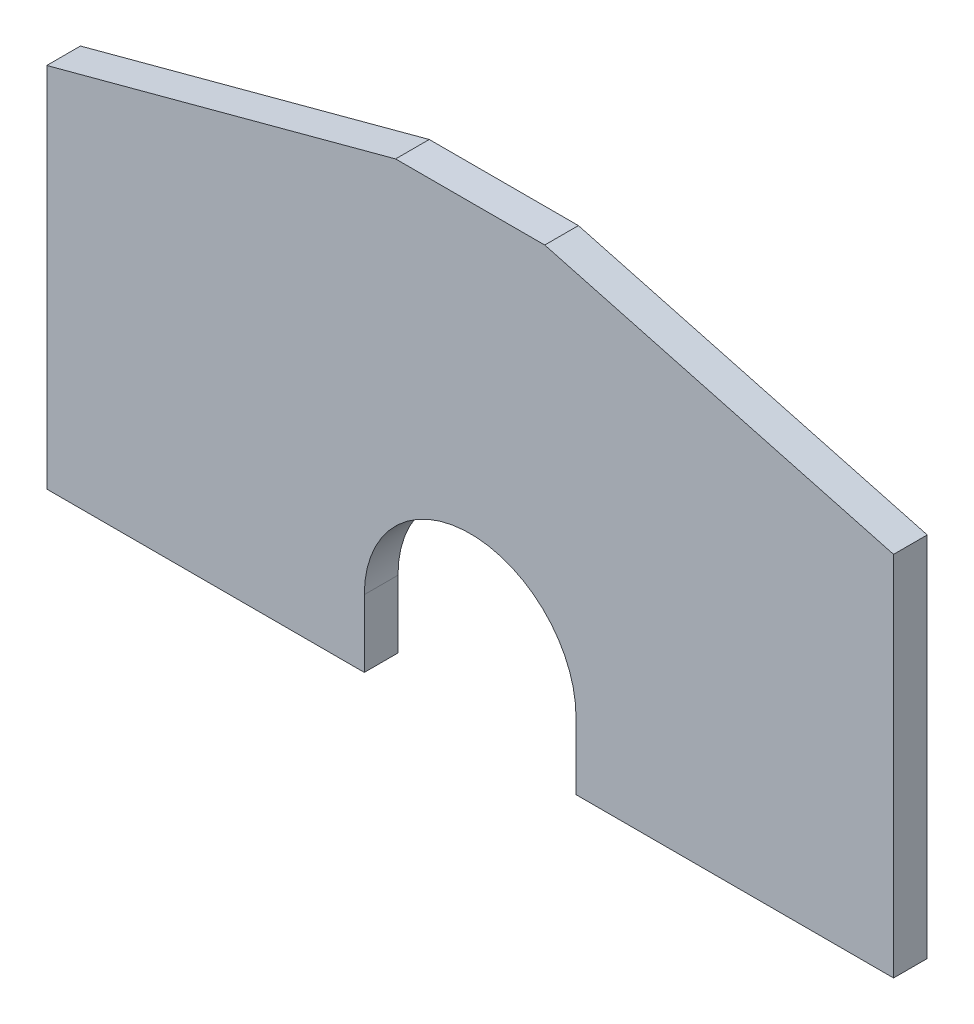
ISO-10303-21;
HEADER;
FILE_DESCRIPTION(('STEP AP214'),'2;1');
FILE_NAME('part.step','',(''),(''),'','','');
FILE_SCHEMA(('AUTOMOTIVE_DESIGN { 1 0 10303 214 1 1 1 1 }'));
ENDSEC;
DATA;
#1=APPLICATION_CONTEXT('core data for automotive mechanical design processes');
#2=APPLICATION_PROTOCOL_DEFINITION('international standard','automotive_design',2000,#1);
#3=PRODUCT_CONTEXT('',#1,'mechanical');
#4=PRODUCT('Part','Part','',(#3));
#5=PRODUCT_RELATED_PRODUCT_CATEGORY('part','',(#4));
#6=PRODUCT_DEFINITION_FORMATION('','',#4);
#7=PRODUCT_DEFINITION_CONTEXT('part definition',#1,'design');
#8=PRODUCT_DEFINITION('design','',#6,#7);
#9=PRODUCT_DEFINITION_SHAPE('','',#8);
#10=(LENGTH_UNIT() NAMED_UNIT(*) SI_UNIT(.MILLI.,.METRE.));
#11=(NAMED_UNIT(*) PLANE_ANGLE_UNIT() SI_UNIT($,.RADIAN.));
#12=(NAMED_UNIT(*) SI_UNIT($,.STERADIAN.) SOLID_ANGLE_UNIT());
#13=UNCERTAINTY_MEASURE_WITH_UNIT(LENGTH_MEASURE(1.E-05),#10,'distance_accuracy_value','');
#14=(GEOMETRIC_REPRESENTATION_CONTEXT(3) GLOBAL_UNCERTAINTY_ASSIGNED_CONTEXT((#13)) GLOBAL_UNIT_ASSIGNED_CONTEXT((#10,
#11,#12)) REPRESENTATION_CONTEXT('',''));
#15=CARTESIAN_POINT('',(0.,0.,0.));
#16=DIRECTION('',(0.,0.,1.));
#17=DIRECTION('',(1.,0.,0.));
#18=AXIS2_PLACEMENT_3D('',#15,#16,#17);
#19=CARTESIAN_POINT('',(-817.12254855416,389.076644166653,35.));
#20=DIRECTION('',(0.258819045102525,-0.965925826289067,0.));
#21=DIRECTION('',(0.965925826289067,0.258819045102525,0.));
#22=AXIS2_PLACEMENT_3D('',#19,#20,#21);
#23=PLANE('',#22);
#24=DIRECTION('',(-0.965925826289067,-0.258819045102525,0.));
#25=VECTOR('',#24,1.);
#26=CARTESIAN_POINT('',(-817.12254855416,389.076644166653,0.));
#27=LINE('',#26,#25);
#28=CARTESIAN_POINT('',(-454.62254855416,486.208226422936,0.));
#29=VERTEX_POINT('',#28);
#30=CARTESIAN_POINT('',(-817.12254855416,389.076644166653,0.));
#31=VERTEX_POINT('',#30);
#32=EDGE_CURVE('E152',#29,#31,#27,.T.);
#33=ORIENTED_EDGE('',*,*,#32,.T.);
#34=DIRECTION('',(0.,0.,-1.));
#35=VECTOR('',#34,1.);
#36=CARTESIAN_POINT('',(-817.12254855416,389.076644166653,35.));
#37=LINE('',#36,#35);
#38=CARTESIAN_POINT('',(-817.12254855416,389.076644166653,35.));
#39=VERTEX_POINT('',#38);
#40=EDGE_CURVE('E11',#39,#31,#37,.T.);
#41=ORIENTED_EDGE('',*,*,#40,.F.);
#42=DIRECTION('',(-0.965925826289067,-0.258819045102525,0.));
#43=VECTOR('',#42,1.);
#44=CARTESIAN_POINT('',(-817.12254855416,389.076644166653,35.));
#45=LINE('',#44,#43);
#46=CARTESIAN_POINT('',(-454.62254855416,486.208226422936,35.));
#47=VERTEX_POINT('',#46);
#48=EDGE_CURVE('E180',#47,#39,#45,.T.);
#49=ORIENTED_EDGE('',*,*,#48,.F.);
#50=DIRECTION('',(0.,0.,-1.));
#51=VECTOR('',#50,1.);
#52=CARTESIAN_POINT('',(-454.62254855416,486.208226422936,35.));
#53=LINE('',#52,#51);
#54=EDGE_CURVE('E148',#47,#29,#53,.T.);
#55=ORIENTED_EDGE('',*,*,#54,.T.);
#56=EDGE_LOOP('',(#33,#41,#49,#55));
#57=FACE_BOUND('',#56,.T.);
#58=ADVANCED_FACE('F39',(#57),#23,.F.);
#59=CARTESIAN_POINT('',(-817.12254855416,389.076644166653,35.));
#60=DIRECTION('',(1.,0.,0.));
#61=DIRECTION('',(0.,0.,-1.));
#62=AXIS2_PLACEMENT_3D('',#59,#60,#61);
#63=PLANE('',#62);
#64=DIRECTION('',(0.,-1.,0.));
#65=VECTOR('',#64,1.);
#66=CARTESIAN_POINT('',(-817.12254855416,389.076644166653,0.));
#67=LINE('',#66,#65);
#68=CARTESIAN_POINT('',(-817.12254855416,7.8066441666529,0.));
#69=VERTEX_POINT('',#68);
#70=EDGE_CURVE('E156',#31,#69,#67,.T.);
#71=ORIENTED_EDGE('',*,*,#70,.T.);
#72=DIRECTION('',(0.,0.,-1.));
#73=VECTOR('',#72,1.);
#74=CARTESIAN_POINT('',(-817.12254855416,7.8066441666529,35.));
#75=LINE('',#74,#73);
#76=CARTESIAN_POINT('',(-817.12254855416,7.8066441666529,35.));
#77=VERTEX_POINT('',#76);
#78=EDGE_CURVE('E48',#77,#69,#75,.T.);
#79=ORIENTED_EDGE('',*,*,#78,.F.);
#80=DIRECTION('',(0.,-1.,0.));
#81=VECTOR('',#80,1.);
#82=CARTESIAN_POINT('',(-817.12254855416,389.076644166653,35.));
#83=LINE('',#82,#81);
#84=EDGE_CURVE('E105',#39,#77,#83,.T.);
#85=ORIENTED_EDGE('',*,*,#84,.F.);
#86=ORIENTED_EDGE('',*,*,#40,.T.);
#87=EDGE_LOOP('',(#71,#79,#85,#86));
#88=FACE_BOUND('',#87,.T.);
#89=ADVANCED_FACE('F244',(#88),#63,.F.);
#90=CARTESIAN_POINT('',(-817.12254855416,7.8066441666529,35.));
#91=DIRECTION('',(0.,1.,0.));
#92=DIRECTION('',(0.,0.,1.));
#93=AXIS2_PLACEMENT_3D('',#90,#91,#92);
#94=PLANE('',#93);
#95=DIRECTION('',(1.,0.,0.));
#96=VECTOR('',#95,1.);
#97=CARTESIAN_POINT('',(-817.12254855416,7.8066441666529,0.));
#98=LINE('',#97,#96);
#99=CARTESIAN_POINT('',(-487.12254855416,7.8066441666529,0.));
#100=VERTEX_POINT('',#99);
#101=EDGE_CURVE('E159',#69,#100,#98,.T.);
#102=ORIENTED_EDGE('',*,*,#101,.T.);
#103=DIRECTION('',(0.,0.,-1.));
#104=VECTOR('',#103,1.);
#105=CARTESIAN_POINT('',(-487.12254855416,7.8066441666529,35.));
#106=LINE('',#105,#104);
#107=CARTESIAN_POINT('',(-487.12254855416,7.8066441666529,35.));
#108=VERTEX_POINT('',#107);
#109=EDGE_CURVE('E199',#108,#100,#106,.T.);
#110=ORIENTED_EDGE('',*,*,#109,.F.);
#111=DIRECTION('',(1.,0.,0.));
#112=VECTOR('',#111,1.);
#113=CARTESIAN_POINT('',(-817.12254855416,7.8066441666529,35.));
#114=LINE('',#113,#112);
#115=EDGE_CURVE('E209',#77,#108,#114,.T.);
#116=ORIENTED_EDGE('',*,*,#115,.F.);
#117=ORIENTED_EDGE('',*,*,#78,.T.);
#118=EDGE_LOOP('',(#102,#110,#116,#117));
#119=FACE_BOUND('',#118,.T.);
#120=ADVANCED_FACE('F207',(#119),#94,.F.);
#121=CARTESIAN_POINT('',(-487.12254855416,7.8066441666529,35.));
#122=DIRECTION('',(-1.,0.,0.));
#123=DIRECTION('',(0.,0.,1.));
#124=AXIS2_PLACEMENT_3D('',#121,#122,#123);
#125=PLANE('',#124);
#126=DIRECTION('',(0.,1.,0.));
#127=VECTOR('',#126,1.);
#128=CARTESIAN_POINT('',(-487.12254855416,7.8066441666529,0.));
#129=LINE('',#128,#127);
#130=CARTESIAN_POINT('',(-487.12254855416,77.8066441666529,0.));
#131=VERTEX_POINT('',#130);
#132=EDGE_CURVE('E162',#100,#131,#129,.T.);
#133=ORIENTED_EDGE('',*,*,#132,.T.);
#134=DIRECTION('',(0.,0.,-1.));
#135=VECTOR('',#134,1.);
#136=CARTESIAN_POINT('',(-487.12254855416,77.8066441666529,35.));
#137=LINE('',#136,#135);
#138=CARTESIAN_POINT('',(-487.12254855416,77.8066441666529,35.));
#139=VERTEX_POINT('',#138);
#140=EDGE_CURVE('E195',#139,#131,#137,.T.);
#141=ORIENTED_EDGE('',*,*,#140,.F.);
#142=DIRECTION('',(0.,1.,0.));
#143=VECTOR('',#142,1.);
#144=CARTESIAN_POINT('',(-487.12254855416,7.8066441666529,35.));
#145=LINE('',#144,#143);
#146=EDGE_CURVE('E228',#108,#139,#145,.T.);
#147=ORIENTED_EDGE('',*,*,#146,.F.);
#148=ORIENTED_EDGE('',*,*,#109,.T.);
#149=EDGE_LOOP('',(#133,#141,#147,#148));
#150=FACE_BOUND('',#149,.T.);
#151=ADVANCED_FACE('F218',(#150),#125,.F.);
#152=CARTESIAN_POINT('',(-377.12254855416,77.8066441666529,35.));
#153=DIRECTION('',(0.,0.,-1.));
#154=DIRECTION('',(-1.,0.,0.));
#155=AXIS2_PLACEMENT_3D('',#152,#153,#154);
#156=CYLINDRICAL_SURFACE('',#155,110.);
#157=CARTESIAN_POINT('',(-377.12254855416,77.8066441666529,0.));
#158=DIRECTION('',(0.,0.,-1.));
#159=DIRECTION('',(-1.,0.,0.));
#160=AXIS2_PLACEMENT_3D('',#157,#158,#159);
#161=CIRCLE('',#160,110.);
#162=CARTESIAN_POINT('',(-267.12254855416,77.8066441666529,0.));
#163=VERTEX_POINT('',#162);
#164=EDGE_CURVE('E165',#131,#163,#161,.T.);
#165=ORIENTED_EDGE('',*,*,#164,.T.);
#166=DIRECTION('',(0.,0.,-1.));
#167=VECTOR('',#166,1.);
#168=CARTESIAN_POINT('',(-267.12254855416,77.8066441666529,35.));
#169=LINE('',#168,#167);
#170=CARTESIAN_POINT('',(-267.12254855416,77.8066441666529,35.));
#171=VERTEX_POINT('',#170);
#172=EDGE_CURVE('E191',#171,#163,#169,.T.);
#173=ORIENTED_EDGE('',*,*,#172,.F.);
#174=CARTESIAN_POINT('',(-377.12254855416,77.8066441666529,35.));
#175=DIRECTION('',(0.,0.,-1.));
#176=DIRECTION('',(-1.,0.,0.));
#177=AXIS2_PLACEMENT_3D('',#174,#175,#176);
#178=CIRCLE('',#177,110.);
#179=EDGE_CURVE('E224',#139,#171,#178,.T.);
#180=ORIENTED_EDGE('',*,*,#179,.F.);
#181=ORIENTED_EDGE('',*,*,#140,.T.);
#182=EDGE_LOOP('',(#165,#173,#180,#181));
#183=FACE_BOUND('',#182,.T.);
#184=ADVANCED_FACE('F222',(#183),#156,.F.);
#185=CARTESIAN_POINT('',(-267.12254855416,7.8066441666529,35.));
#186=DIRECTION('',(1.,0.,0.));
#187=DIRECTION('',(0.,0.,-1.));
#188=AXIS2_PLACEMENT_3D('',#185,#186,#187);
#189=PLANE('',#188);
#190=DIRECTION('',(0.,-1.,0.));
#191=VECTOR('',#190,1.);
#192=CARTESIAN_POINT('',(-267.12254855416,7.8066441666529,0.));
#193=LINE('',#192,#191);
#194=CARTESIAN_POINT('',(-267.12254855416,7.8066441666529,0.));
#195=VERTEX_POINT('',#194);
#196=EDGE_CURVE('E168',#163,#195,#193,.T.);
#197=ORIENTED_EDGE('',*,*,#196,.T.);
#198=DIRECTION('',(0.,0.,-1.));
#199=VECTOR('',#198,1.);
#200=CARTESIAN_POINT('',(-267.12254855416,7.8066441666529,35.));
#201=LINE('',#200,#199);
#202=CARTESIAN_POINT('',(-267.12254855416,7.8066441666529,35.));
#203=VERTEX_POINT('',#202);
#204=EDGE_CURVE('E187',#203,#195,#201,.T.);
#205=ORIENTED_EDGE('',*,*,#204,.F.);
#206=DIRECTION('',(0.,-1.,0.));
#207=VECTOR('',#206,1.);
#208=CARTESIAN_POINT('',(-267.12254855416,7.8066441666529,35.));
#209=LINE('',#208,#207);
#210=EDGE_CURVE('E227',#171,#203,#209,.T.);
#211=ORIENTED_EDGE('',*,*,#210,.F.);
#212=ORIENTED_EDGE('',*,*,#172,.T.);
#213=EDGE_LOOP('',(#197,#205,#211,#212));
#214=FACE_BOUND('',#213,.T.);
#215=ADVANCED_FACE('F256',(#214),#189,.F.);
#216=CARTESIAN_POINT('',(62.8774514458404,7.8066441666529,35.));
#217=DIRECTION('',(0.,1.,0.));
#218=DIRECTION('',(0.,0.,1.));
#219=AXIS2_PLACEMENT_3D('',#216,#217,#218);
#220=PLANE('',#219);
#221=DIRECTION('',(1.,0.,0.));
#222=VECTOR('',#221,1.);
#223=CARTESIAN_POINT('',(62.8774514458404,7.8066441666529,0.));
#224=LINE('',#223,#222);
#225=CARTESIAN_POINT('',(62.8774514458404,7.8066441666529,0.));
#226=VERTEX_POINT('',#225);
#227=EDGE_CURVE('E171',#195,#226,#224,.T.);
#228=ORIENTED_EDGE('',*,*,#227,.T.);
#229=DIRECTION('',(0.,0.,-1.));
#230=VECTOR('',#229,1.);
#231=CARTESIAN_POINT('',(62.8774514458404,7.8066441666529,35.));
#232=LINE('',#231,#230);
#233=CARTESIAN_POINT('',(62.8774514458404,7.8066441666529,35.));
#234=VERTEX_POINT('',#233);
#235=EDGE_CURVE('E141',#234,#226,#232,.T.);
#236=ORIENTED_EDGE('',*,*,#235,.F.);
#237=DIRECTION('',(1.,0.,0.));
#238=VECTOR('',#237,1.);
#239=CARTESIAN_POINT('',(62.8774514458404,7.8066441666529,35.));
#240=LINE('',#239,#238);
#241=EDGE_CURVE('E130',#203,#234,#240,.T.);
#242=ORIENTED_EDGE('',*,*,#241,.F.);
#243=ORIENTED_EDGE('',*,*,#204,.T.);
#244=EDGE_LOOP('',(#228,#236,#242,#243));
#245=FACE_BOUND('',#244,.T.);
#246=ADVANCED_FACE('F259',(#245),#220,.F.);
#247=CARTESIAN_POINT('',(62.8774514458404,389.076644166653,35.));
#248=DIRECTION('',(-1.,0.,0.));
#249=DIRECTION('',(0.,0.,1.));
#250=AXIS2_PLACEMENT_3D('',#247,#248,#249);
#251=PLANE('',#250);
#252=DIRECTION('',(0.,1.,0.));
#253=VECTOR('',#252,1.);
#254=CARTESIAN_POINT('',(62.8774514458404,389.076644166653,0.));
#255=LINE('',#254,#253);
#256=CARTESIAN_POINT('',(62.8774514458404,389.076644166653,0.));
#257=VERTEX_POINT('',#256);
#258=EDGE_CURVE('E139',#226,#257,#255,.T.);
#259=ORIENTED_EDGE('',*,*,#258,.T.);
#260=DIRECTION('',(0.,0.,-1.));
#261=VECTOR('',#260,1.);
#262=CARTESIAN_POINT('',(62.8774514458404,389.076644166653,35.));
#263=LINE('',#262,#261);
#264=CARTESIAN_POINT('',(62.8774514458404,389.076644166653,35.));
#265=VERTEX_POINT('',#264);
#266=EDGE_CURVE('E136',#265,#257,#263,.T.);
#267=ORIENTED_EDGE('',*,*,#266,.F.);
#268=DIRECTION('',(0.,1.,0.));
#269=VECTOR('',#268,1.);
#270=CARTESIAN_POINT('',(62.8774514458404,389.076644166653,35.));
#271=LINE('',#270,#269);
#272=EDGE_CURVE('E124',#234,#265,#271,.T.);
#273=ORIENTED_EDGE('',*,*,#272,.F.);
#274=ORIENTED_EDGE('',*,*,#235,.T.);
#275=EDGE_LOOP('',(#259,#267,#273,#274));
#276=FACE_BOUND('',#275,.T.);
#277=ADVANCED_FACE('F137',(#276),#251,.F.);
#278=CARTESIAN_POINT('',(-299.62254855416,486.208226422936,35.));
#279=DIRECTION('',(-0.258819045102525,-0.965925826289067,0.));
#280=DIRECTION('',(0.965925826289067,-0.258819045102525,0.));
#281=AXIS2_PLACEMENT_3D('',#278,#279,#280);
#282=PLANE('',#281);
#283=DIRECTION('',(-0.965925826289067,0.258819045102525,0.));
#284=VECTOR('',#283,1.);
#285=CARTESIAN_POINT('',(-299.62254855416,486.208226422936,0.));
#286=LINE('',#285,#284);
#287=CARTESIAN_POINT('',(-299.62254855416,486.208226422936,0.));
#288=VERTEX_POINT('',#287);
#289=EDGE_CURVE('E91',#257,#288,#286,.T.);
#290=ORIENTED_EDGE('',*,*,#289,.T.);
#291=DIRECTION('',(0.,0.,-1.));
#292=VECTOR('',#291,1.);
#293=CARTESIAN_POINT('',(-299.62254855416,486.208226422936,35.));
#294=LINE('',#293,#292);
#295=CARTESIAN_POINT('',(-299.62254855416,486.208226422936,35.));
#296=VERTEX_POINT('',#295);
#297=EDGE_CURVE('E142',#296,#288,#294,.T.);
#298=ORIENTED_EDGE('',*,*,#297,.F.);
#299=DIRECTION('',(-0.965925826289067,0.258819045102525,0.));
#300=VECTOR('',#299,1.);
#301=CARTESIAN_POINT('',(-299.62254855416,486.208226422936,35.));
#302=LINE('',#301,#300);
#303=EDGE_CURVE('E128',#265,#296,#302,.T.);
#304=ORIENTED_EDGE('',*,*,#303,.F.);
#305=ORIENTED_EDGE('',*,*,#266,.T.);
#306=EDGE_LOOP('',(#290,#298,#304,#305));
#307=FACE_BOUND('',#306,.T.);
#308=ADVANCED_FACE('F144',(#307),#282,.F.);
#309=CARTESIAN_POINT('',(-454.62254855416,486.208226422936,35.));
#310=DIRECTION('',(0.,-1.,0.));
#311=DIRECTION('',(0.,0.,-1.));
#312=AXIS2_PLACEMENT_3D('',#309,#310,#311);
#313=PLANE('',#312);
#314=DIRECTION('',(-1.,0.,0.));
#315=VECTOR('',#314,1.);
#316=CARTESIAN_POINT('',(-454.62254855416,486.208226422936,0.));
#317=LINE('',#316,#315);
#318=EDGE_CURVE('E97',#288,#29,#317,.T.);
#319=ORIENTED_EDGE('',*,*,#318,.T.);
#320=ORIENTED_EDGE('',*,*,#54,.F.);
#321=DIRECTION('',(-1.,0.,0.));
#322=VECTOR('',#321,1.);
#323=CARTESIAN_POINT('',(-454.62254855416,486.208226422936,35.));
#324=LINE('',#323,#322);
#325=EDGE_CURVE('E56',#296,#47,#324,.T.);
#326=ORIENTED_EDGE('',*,*,#325,.F.);
#327=ORIENTED_EDGE('',*,*,#297,.T.);
#328=EDGE_LOOP('',(#319,#320,#326,#327));
#329=FACE_BOUND('',#328,.T.);
#330=ADVANCED_FACE('F268',(#329),#313,.F.);
#331=CARTESIAN_POINT('',(-377.12254855416,77.8066441666529,35.));
#332=DIRECTION('',(0.,0.,-1.));
#333=DIRECTION('',(-1.,0.,0.));
#334=AXIS2_PLACEMENT_3D('',#331,#332,#333);
#335=PLANE('',#334);
#336=ORIENTED_EDGE('',*,*,#48,.T.);
#337=ORIENTED_EDGE('',*,*,#84,.T.);
#338=ORIENTED_EDGE('',*,*,#115,.T.);
#339=ORIENTED_EDGE('',*,*,#146,.T.);
#340=ORIENTED_EDGE('',*,*,#179,.T.);
#341=ORIENTED_EDGE('',*,*,#210,.T.);
#342=ORIENTED_EDGE('',*,*,#241,.T.);
#343=ORIENTED_EDGE('',*,*,#272,.T.);
#344=ORIENTED_EDGE('',*,*,#303,.T.);
#345=ORIENTED_EDGE('',*,*,#325,.T.);
#346=EDGE_LOOP('',(#336,#337,#338,#339,#340,#341,#342,#343,#344,#345));
#347=FACE_BOUND('',#346,.T.);
#348=ADVANCED_FACE('F126',(#347),#335,.F.);
#349=CARTESIAN_POINT('',(-377.12254855416,77.8066441666529,0.));
#350=DIRECTION('',(0.,0.,-1.));
#351=DIRECTION('',(-1.,0.,0.));
#352=AXIS2_PLACEMENT_3D('',#349,#350,#351);
#353=PLANE('',#352);
#354=ORIENTED_EDGE('',*,*,#32,.F.);
#355=ORIENTED_EDGE('',*,*,#318,.F.);
#356=ORIENTED_EDGE('',*,*,#289,.F.);
#357=ORIENTED_EDGE('',*,*,#258,.F.);
#358=ORIENTED_EDGE('',*,*,#227,.F.);
#359=ORIENTED_EDGE('',*,*,#196,.F.);
#360=ORIENTED_EDGE('',*,*,#164,.F.);
#361=ORIENTED_EDGE('',*,*,#132,.F.);
#362=ORIENTED_EDGE('',*,*,#101,.F.);
#363=ORIENTED_EDGE('',*,*,#70,.F.);
#364=EDGE_LOOP('',(#354,#355,#356,#357,#358,#359,#360,#361,#362,#363));
#365=FACE_BOUND('',#364,.T.);
#366=ADVANCED_FACE('F213',(#365),#353,.T.);
#367=CLOSED_SHELL('',(#58,#89,#120,#151,#184,#215,#246,#277,#308,#330,#348,#366));
#368=MANIFOLD_SOLID_BREP('B2',#367);
#369=ADVANCED_BREP_SHAPE_REPRESENTATION('',(#18,#368),#14);
#370=SHAPE_DEFINITION_REPRESENTATION(#9,#369);
ENDSEC;
END-ISO-10303-21;
